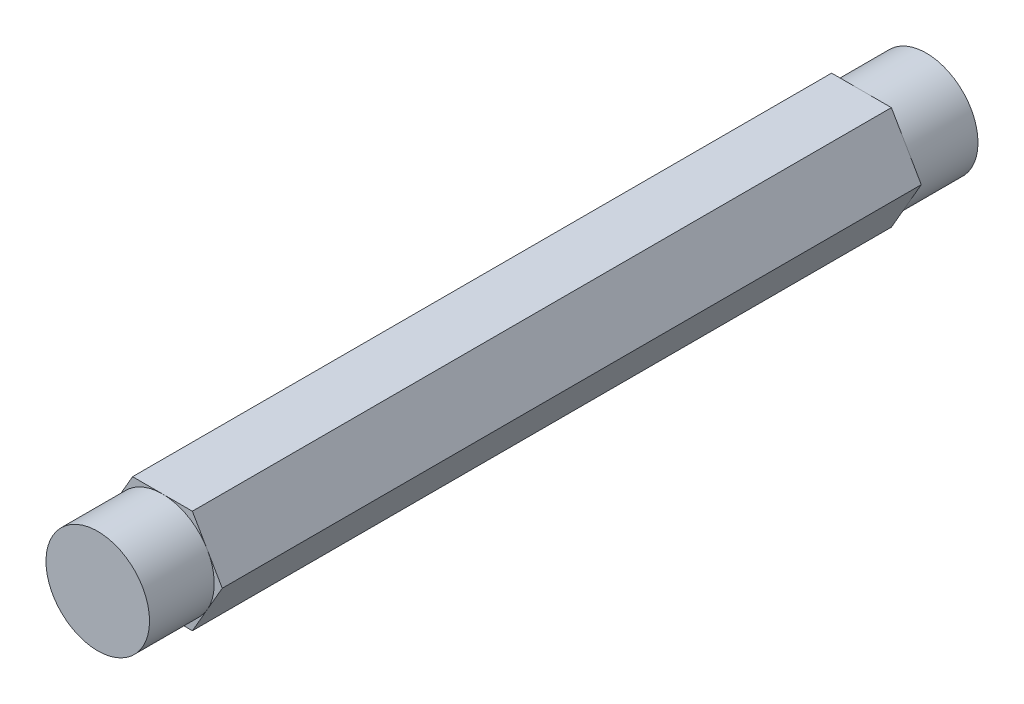
ISO-10303-21;
HEADER;
FILE_DESCRIPTION(('STEP AP214'),'2;1');
FILE_NAME('part.step','',(''),(''),'','','');
FILE_SCHEMA(('AUTOMOTIVE_DESIGN { 1 0 10303 214 1 1 1 1 }'));
ENDSEC;
DATA;
#1=APPLICATION_CONTEXT('core data for automotive mechanical design processes');
#2=APPLICATION_PROTOCOL_DEFINITION('international standard','automotive_design',2000,#1);
#3=PRODUCT_CONTEXT('',#1,'mechanical');
#4=PRODUCT('Part','Part','',(#3));
#5=PRODUCT_RELATED_PRODUCT_CATEGORY('part','',(#4));
#6=PRODUCT_DEFINITION_FORMATION('','',#4);
#7=PRODUCT_DEFINITION_CONTEXT('part definition',#1,'design');
#8=PRODUCT_DEFINITION('design','',#6,#7);
#9=PRODUCT_DEFINITION_SHAPE('','',#8);
#10=(LENGTH_UNIT() NAMED_UNIT(*) SI_UNIT(.MILLI.,.METRE.));
#11=(NAMED_UNIT(*) PLANE_ANGLE_UNIT() SI_UNIT($,.RADIAN.));
#12=(NAMED_UNIT(*) SI_UNIT($,.STERADIAN.) SOLID_ANGLE_UNIT());
#13=UNCERTAINTY_MEASURE_WITH_UNIT(LENGTH_MEASURE(1.E-05),#10,'distance_accuracy_value','');
#14=(GEOMETRIC_REPRESENTATION_CONTEXT(3) GLOBAL_UNCERTAINTY_ASSIGNED_CONTEXT((#13)) GLOBAL_UNIT_ASSIGNED_CONTEXT((#10,
#11,#12)) REPRESENTATION_CONTEXT('',''));
#15=CARTESIAN_POINT('',(0.,0.,0.));
#16=DIRECTION('',(0.,0.,1.));
#17=DIRECTION('',(1.,0.,0.));
#18=AXIS2_PLACEMENT_3D('',#15,#16,#17);
#19=CARTESIAN_POINT('',(0.,0.,-50.8));
#20=DIRECTION('',(0.,0.,1.));
#21=DIRECTION('',(1.,0.,0.));
#22=AXIS2_PLACEMENT_3D('',#19,#20,#21);
#23=PLANE('',#22);
#24=CARTESIAN_POINT('',(0.,0.,-50.8));
#25=DIRECTION('',(0.,0.,1.));
#26=DIRECTION('',(1.,0.,0.));
#27=AXIS2_PLACEMENT_3D('',#24,#25,#26);
#28=CIRCLE('',#27,6.35);
#29=CARTESIAN_POINT('',(6.35,0.,-50.8));
#30=VERTEX_POINT('',#29);
#31=EDGE_CURVE('E177',#30,#30,#28,.F.);
#32=ORIENTED_EDGE('',*,*,#31,.T.);
#33=EDGE_LOOP('',(#32));
#34=FACE_BOUND('',#33,.T.);
#35=ADVANCED_FACE('F49',(#34),#23,.F.);
#36=CARTESIAN_POINT('',(5.49926131403116,3.17499999999999,50.8));
#37=DIRECTION('',(-0.866025403784438,-0.500000000000001,0.));
#38=DIRECTION('',(0.500000000000001,-0.866025403784438,0.));
#39=AXIS2_PLACEMENT_3D('',#36,#37,#38);
#40=PLANE('',#39);
#41=DIRECTION('',(0.500000000000001,-0.866025403784438,0.));
#42=VECTOR('',#41,1.);
#43=CARTESIAN_POINT('',(5.49926131403116,3.17499999999999,-42.8625));
#44=LINE('',#43,#42);
#45=CARTESIAN_POINT('',(5.49926131403117,3.175,-42.8625));
#46=VERTEX_POINT('',#45);
#47=CARTESIAN_POINT('',(7.33234841870822,0.,-42.8625));
#48=VERTEX_POINT('',#47);
#49=EDGE_CURVE('E197',#46,#48,#44,.T.);
#50=ORIENTED_EDGE('',*,*,#49,.F.);
#51=DIRECTION('',(0.500000000000001,-0.866025403784438,0.));
#52=VECTOR('',#51,1.);
#53=CARTESIAN_POINT('',(5.49926131403116,3.17499999999999,-42.8625));
#54=LINE('',#53,#52);
#55=CARTESIAN_POINT('',(3.6661742093541,6.34999999999998,-42.8625));
#56=VERTEX_POINT('',#55);
#57=EDGE_CURVE('E488',#56,#46,#54,.T.);
#58=ORIENTED_EDGE('',*,*,#57,.F.);
#59=DIRECTION('',(0.,0.,-1.));
#60=VECTOR('',#59,1.);
#61=CARTESIAN_POINT('',(3.6661742093541,6.34999999999998,50.8));
#62=LINE('',#61,#60);
#63=CARTESIAN_POINT('',(3.6661742093541,6.34999999999998,42.8625));
#64=VERTEX_POINT('',#63);
#65=EDGE_CURVE('E254',#64,#56,#62,.T.);
#66=ORIENTED_EDGE('',*,*,#65,.F.);
#67=DIRECTION('',(0.500000000000001,-0.866025403784438,0.));
#68=VECTOR('',#67,1.);
#69=CARTESIAN_POINT('',(5.49926131403116,3.17499999999999,42.8625));
#70=LINE('',#69,#68);
#71=CARTESIAN_POINT('',(5.49926131403117,3.175,42.8625));
#72=VERTEX_POINT('',#71);
#73=EDGE_CURVE('E206',#64,#72,#70,.T.);
#74=ORIENTED_EDGE('',*,*,#73,.T.);
#75=DIRECTION('',(0.500000000000001,-0.866025403784438,0.));
#76=VECTOR('',#75,1.);
#77=CARTESIAN_POINT('',(5.49926131403116,3.17499999999999,42.8625));
#78=LINE('',#77,#76);
#79=CARTESIAN_POINT('',(7.33234841870822,0.,42.8625));
#80=VERTEX_POINT('',#79);
#81=EDGE_CURVE('E243',#72,#80,#78,.T.);
#82=ORIENTED_EDGE('',*,*,#81,.T.);
#83=DIRECTION('',(0.,0.,-1.));
#84=VECTOR('',#83,1.);
#85=CARTESIAN_POINT('',(7.33234841870822,0.,50.8));
#86=LINE('',#85,#84);
#87=EDGE_CURVE('E58',#80,#48,#86,.T.);
#88=ORIENTED_EDGE('',*,*,#87,.T.);
#89=EDGE_LOOP('',(#50,#58,#66,#74,#82,#88));
#90=FACE_BOUND('',#89,.T.);
#91=ADVANCED_FACE('F260',(#90),#40,.F.);
#92=CARTESIAN_POINT('',(0.,-6.34999999999997,50.8));
#93=DIRECTION('',(0.,1.,0.));
#94=DIRECTION('',(-1.,0.,0.));
#95=AXIS2_PLACEMENT_3D('',#92,#93,#94);
#96=PLANE('',#95);
#97=DIRECTION('',(-1.,0.,0.));
#98=VECTOR('',#97,1.);
#99=CARTESIAN_POINT('',(0.,-6.34999999999997,-42.8625));
#100=LINE('',#99,#98);
#101=CARTESIAN_POINT('',(0.,-6.34999999999999,-42.8625));
#102=VERTEX_POINT('',#101);
#103=CARTESIAN_POINT('',(-3.66617420935405,-6.35000000000001,-42.8625));
#104=VERTEX_POINT('',#103);
#105=EDGE_CURVE('E174',#102,#104,#100,.T.);
#106=ORIENTED_EDGE('',*,*,#105,.F.);
#107=DIRECTION('',(-1.,0.,0.));
#108=VECTOR('',#107,1.);
#109=CARTESIAN_POINT('',(0.,-6.34999999999997,-42.8625));
#110=LINE('',#109,#108);
#111=CARTESIAN_POINT('',(3.66617420935418,-6.34999999999993,-42.8625));
#112=VERTEX_POINT('',#111);
#113=EDGE_CURVE('E150',#112,#102,#110,.T.);
#114=ORIENTED_EDGE('',*,*,#113,.F.);
#115=DIRECTION('',(0.,0.,-1.));
#116=VECTOR('',#115,1.);
#117=CARTESIAN_POINT('',(3.66617420935418,-6.34999999999993,50.8));
#118=LINE('',#117,#116);
#119=CARTESIAN_POINT('',(3.66617420935418,-6.34999999999993,42.8625));
#120=VERTEX_POINT('',#119);
#121=EDGE_CURVE('E12',#120,#112,#118,.T.);
#122=ORIENTED_EDGE('',*,*,#121,.F.);
#123=DIRECTION('',(-1.,0.,0.));
#124=VECTOR('',#123,1.);
#125=CARTESIAN_POINT('',(0.,-6.34999999999997,42.8625));
#126=LINE('',#125,#124);
#127=CARTESIAN_POINT('',(0.,-6.34999999999999,42.8625));
#128=VERTEX_POINT('',#127);
#129=EDGE_CURVE('E214',#120,#128,#126,.T.);
#130=ORIENTED_EDGE('',*,*,#129,.T.);
#131=DIRECTION('',(-1.,0.,0.));
#132=VECTOR('',#131,1.);
#133=CARTESIAN_POINT('',(0.,-6.34999999999997,42.8625));
#134=LINE('',#133,#132);
#135=CARTESIAN_POINT('',(-3.66617420935405,-6.35000000000001,42.8625));
#136=VERTEX_POINT('',#135);
#137=EDGE_CURVE('E237',#128,#136,#134,.T.);
#138=ORIENTED_EDGE('',*,*,#137,.T.);
#139=DIRECTION('',(0.,0.,-1.));
#140=VECTOR('',#139,1.);
#141=CARTESIAN_POINT('',(-3.66617420935405,-6.35000000000001,50.8));
#142=LINE('',#141,#140);
#143=EDGE_CURVE('E181',#136,#104,#142,.T.);
#144=ORIENTED_EDGE('',*,*,#143,.T.);
#145=EDGE_LOOP('',(#106,#114,#122,#130,#138,#144));
#146=FACE_BOUND('',#145,.T.);
#147=ADVANCED_FACE('F51',(#146),#96,.F.);
#148=CARTESIAN_POINT('',(-5.49926131403118,3.17499999999995,50.8));
#149=DIRECTION('',(0.866025403784442,-0.499999999999995,0.));
#150=DIRECTION('',(0.499999999999995,0.866025403784442,0.));
#151=AXIS2_PLACEMENT_3D('',#148,#149,#150);
#152=PLANE('',#151);
#153=DIRECTION('',(0.499999999999995,0.866025403784442,0.));
#154=VECTOR('',#153,1.);
#155=CARTESIAN_POINT('',(-5.49926131403118,3.17499999999995,-42.8625));
#156=LINE('',#155,#154);
#157=CARTESIAN_POINT('',(-5.49926131403119,3.17499999999996,-42.8625));
#158=VERTEX_POINT('',#157);
#159=CARTESIAN_POINT('',(-3.66617420935414,6.34999999999996,-42.8625));
#160=VERTEX_POINT('',#159);
#161=EDGE_CURVE('E190',#158,#160,#156,.T.);
#162=ORIENTED_EDGE('',*,*,#161,.F.);
#163=DIRECTION('',(0.499999999999995,0.866025403784442,0.));
#164=VECTOR('',#163,1.);
#165=CARTESIAN_POINT('',(-5.49926131403118,3.17499999999995,-42.8625));
#166=LINE('',#165,#164);
#167=CARTESIAN_POINT('',(-7.33234841870822,0.,-42.8625));
#168=VERTEX_POINT('',#167);
#169=EDGE_CURVE('E203',#168,#158,#166,.T.);
#170=ORIENTED_EDGE('',*,*,#169,.F.);
#171=DIRECTION('',(0.,0.,-1.));
#172=VECTOR('',#171,1.);
#173=CARTESIAN_POINT('',(-7.33234841870822,0.,50.8));
#174=LINE('',#173,#172);
#175=CARTESIAN_POINT('',(-7.33234841870822,0.,42.8625));
#176=VERTEX_POINT('',#175);
#177=EDGE_CURVE('E248',#176,#168,#174,.T.);
#178=ORIENTED_EDGE('',*,*,#177,.F.);
#179=DIRECTION('',(0.499999999999995,0.866025403784442,0.));
#180=VECTOR('',#179,1.);
#181=CARTESIAN_POINT('',(-5.49926131403118,3.17499999999995,42.8625));
#182=LINE('',#181,#180);
#183=CARTESIAN_POINT('',(-5.49926131403119,3.17499999999996,42.8625));
#184=VERTEX_POINT('',#183);
#185=EDGE_CURVE('E222',#176,#184,#182,.T.);
#186=ORIENTED_EDGE('',*,*,#185,.T.);
#187=DIRECTION('',(0.499999999999995,0.866025403784442,0.));
#188=VECTOR('',#187,1.);
#189=CARTESIAN_POINT('',(-5.49926131403118,3.17499999999995,42.8625));
#190=LINE('',#189,#188);
#191=CARTESIAN_POINT('',(-3.66617420935414,6.34999999999996,42.8625));
#192=VERTEX_POINT('',#191);
#193=EDGE_CURVE('E226',#184,#192,#190,.T.);
#194=ORIENTED_EDGE('',*,*,#193,.T.);
#195=DIRECTION('',(0.,0.,-1.));
#196=VECTOR('',#195,1.);
#197=CARTESIAN_POINT('',(-3.66617420935414,6.34999999999996,50.8));
#198=LINE('',#197,#196);
#199=EDGE_CURVE('E251',#192,#160,#198,.T.);
#200=ORIENTED_EDGE('',*,*,#199,.T.);
#201=EDGE_LOOP('',(#162,#170,#178,#186,#194,#200));
#202=FACE_BOUND('',#201,.T.);
#203=ADVANCED_FACE('F295',(#202),#152,.F.);
#204=CARTESIAN_POINT('',(0.,6.34999999999997,50.8));
#205=DIRECTION('',(0.,-1.,0.));
#206=DIRECTION('',(1.,0.,0.));
#207=AXIS2_PLACEMENT_3D('',#204,#205,#206);
#208=PLANE('',#207);
#209=ORIENTED_EDGE('',*,*,#65,.T.);
#210=DIRECTION('',(1.,0.,0.));
#211=VECTOR('',#210,1.);
#212=CARTESIAN_POINT('',(0.,6.34999999999997,-42.8625));
#213=LINE('',#212,#211);
#214=CARTESIAN_POINT('',(0.,6.34999999999999,-42.8625));
#215=VERTEX_POINT('',#214);
#216=EDGE_CURVE('E487',#215,#56,#213,.T.);
#217=ORIENTED_EDGE('',*,*,#216,.F.);
#218=DIRECTION('',(1.,0.,0.));
#219=VECTOR('',#218,1.);
#220=CARTESIAN_POINT('',(0.,6.34999999999997,-42.8625));
#221=LINE('',#220,#219);
#222=EDGE_CURVE('E183',#160,#215,#221,.T.);
#223=ORIENTED_EDGE('',*,*,#222,.F.);
#224=ORIENTED_EDGE('',*,*,#199,.F.);
#225=DIRECTION('',(1.,0.,0.));
#226=VECTOR('',#225,1.);
#227=CARTESIAN_POINT('',(0.,6.34999999999997,42.8625));
#228=LINE('',#227,#226);
#229=CARTESIAN_POINT('',(0.,6.34999999999999,42.8625));
#230=VERTEX_POINT('',#229);
#231=EDGE_CURVE('E229',#192,#230,#228,.T.);
#232=ORIENTED_EDGE('',*,*,#231,.T.);
#233=DIRECTION('',(1.,0.,0.));
#234=VECTOR('',#233,1.);
#235=CARTESIAN_POINT('',(0.,6.34999999999997,42.8625));
#236=LINE('',#235,#234);
#237=EDGE_CURVE('E189',#230,#64,#236,.T.);
#238=ORIENTED_EDGE('',*,*,#237,.T.);
#239=EDGE_LOOP('',(#209,#217,#223,#224,#232,#238));
#240=FACE_BOUND('',#239,.T.);
#241=ADVANCED_FACE('F298',(#240),#208,.F.);
#242=CARTESIAN_POINT('',(5.4992613140312,-3.17499999999997,50.8));
#243=DIRECTION('',(-0.866025403784441,0.499999999999995,0.));
#244=DIRECTION('',(-0.499999999999995,-0.866025403784442,0.));
#245=AXIS2_PLACEMENT_3D('',#242,#243,#244);
#246=PLANE('',#245);
#247=ORIENTED_EDGE('',*,*,#121,.T.);
#248=DIRECTION('',(-0.499999999999995,-0.866025403784442,0.));
#249=VECTOR('',#248,1.);
#250=CARTESIAN_POINT('',(5.4992613140312,-3.17499999999997,-42.8625));
#251=LINE('',#250,#249);
#252=CARTESIAN_POINT('',(5.4992613140312,-3.17499999999997,-42.8625));
#253=VERTEX_POINT('',#252);
#254=EDGE_CURVE('E155',#253,#112,#251,.T.);
#255=ORIENTED_EDGE('',*,*,#254,.F.);
#256=DIRECTION('',(-0.499999999999995,-0.866025403784442,0.));
#257=VECTOR('',#256,1.);
#258=CARTESIAN_POINT('',(5.4992613140312,-3.17499999999997,-42.8625));
#259=LINE('',#258,#257);
#260=EDGE_CURVE('E199',#48,#253,#259,.T.);
#261=ORIENTED_EDGE('',*,*,#260,.F.);
#262=ORIENTED_EDGE('',*,*,#87,.F.);
#263=DIRECTION('',(-0.499999999999995,-0.866025403784442,0.));
#264=VECTOR('',#263,1.);
#265=CARTESIAN_POINT('',(5.4992613140312,-3.17499999999997,42.8625));
#266=LINE('',#265,#264);
#267=CARTESIAN_POINT('',(5.4992613140312,-3.17499999999997,42.8625));
#268=VERTEX_POINT('',#267);
#269=EDGE_CURVE('E85',#80,#268,#266,.T.);
#270=ORIENTED_EDGE('',*,*,#269,.T.);
#271=DIRECTION('',(-0.499999999999995,-0.866025403784442,0.));
#272=VECTOR('',#271,1.);
#273=CARTESIAN_POINT('',(5.4992613140312,-3.17499999999997,42.8625));
#274=LINE('',#273,#272);
#275=EDGE_CURVE('E211',#268,#120,#274,.T.);
#276=ORIENTED_EDGE('',*,*,#275,.T.);
#277=EDGE_LOOP('',(#247,#255,#261,#262,#270,#276));
#278=FACE_BOUND('',#277,.T.);
#279=ADVANCED_FACE('F264',(#278),#246,.F.);
#280=CARTESIAN_POINT('',(-5.49926131403114,-3.17500000000003,50.8));
#281=DIRECTION('',(0.866025403784435,0.500000000000007,0.));
#282=DIRECTION('',(-0.500000000000007,0.866025403784435,0.));
#283=AXIS2_PLACEMENT_3D('',#280,#281,#282);
#284=PLANE('',#283);
#285=ORIENTED_EDGE('',*,*,#177,.T.);
#286=DIRECTION('',(-0.500000000000007,0.866025403784435,0.));
#287=VECTOR('',#286,1.);
#288=CARTESIAN_POINT('',(-5.49926131403114,-3.17500000000003,-42.8625));
#289=LINE('',#288,#287);
#290=CARTESIAN_POINT('',(-5.49926131403115,-3.17500000000004,-42.8625));
#291=VERTEX_POINT('',#290);
#292=EDGE_CURVE('E501',#291,#168,#289,.T.);
#293=ORIENTED_EDGE('',*,*,#292,.F.);
#294=DIRECTION('',(-0.500000000000007,0.866025403784435,0.));
#295=VECTOR('',#294,1.);
#296=CARTESIAN_POINT('',(-5.49926131403114,-3.17500000000003,-42.8625));
#297=LINE('',#296,#295);
#298=EDGE_CURVE('E176',#104,#291,#297,.T.);
#299=ORIENTED_EDGE('',*,*,#298,.F.);
#300=ORIENTED_EDGE('',*,*,#143,.F.);
#301=DIRECTION('',(-0.500000000000007,0.866025403784435,0.));
#302=VECTOR('',#301,1.);
#303=CARTESIAN_POINT('',(-5.49926131403114,-3.17500000000003,42.8625));
#304=LINE('',#303,#302);
#305=CARTESIAN_POINT('',(-5.49926131403115,-3.17500000000004,42.8625));
#306=VERTEX_POINT('',#305);
#307=EDGE_CURVE('E77',#136,#306,#304,.T.);
#308=ORIENTED_EDGE('',*,*,#307,.T.);
#309=DIRECTION('',(-0.500000000000007,0.866025403784435,0.));
#310=VECTOR('',#309,1.);
#311=CARTESIAN_POINT('',(-5.49926131403114,-3.17500000000003,42.8625));
#312=LINE('',#311,#310);
#313=EDGE_CURVE('E217',#306,#176,#312,.T.);
#314=ORIENTED_EDGE('',*,*,#313,.T.);
#315=EDGE_LOOP('',(#285,#293,#299,#300,#308,#314));
#316=FACE_BOUND('',#315,.T.);
#317=ADVANCED_FACE('F291',(#316),#284,.F.);
#318=CARTESIAN_POINT('',(0.,0.,50.8));
#319=DIRECTION('',(0.,0.,1.));
#320=DIRECTION('',(1.,0.,0.));
#321=AXIS2_PLACEMENT_3D('',#318,#319,#320);
#322=PLANE('',#321);
#323=CARTESIAN_POINT('',(0.,0.,50.8));
#324=DIRECTION('',(0.,0.,1.));
#325=DIRECTION('',(1.,0.,0.));
#326=AXIS2_PLACEMENT_3D('',#323,#324,#325);
#327=CIRCLE('',#326,6.35);
#328=CARTESIAN_POINT('',(6.35,0.,50.8));
#329=VERTEX_POINT('',#328);
#330=EDGE_CURVE('E234',#329,#329,#327,.T.);
#331=ORIENTED_EDGE('',*,*,#330,.T.);
#332=EDGE_LOOP('',(#331));
#333=FACE_BOUND('',#332,.T.);
#334=ADVANCED_FACE('F289',(#333),#322,.T.);
#335=CARTESIAN_POINT('',(0.,0.,42.8625));
#336=DIRECTION('',(0.,0.,1.));
#337=DIRECTION('',(1.,0.,0.));
#338=AXIS2_PLACEMENT_3D('',#335,#336,#337);
#339=PLANE('',#338);
#340=CARTESIAN_POINT('',(0.,0.,42.8625));
#341=DIRECTION('',(0.,0.,1.));
#342=DIRECTION('',(1.,0.,0.));
#343=AXIS2_PLACEMENT_3D('',#340,#341,#342);
#344=CIRCLE('',#343,6.35);
#345=EDGE_CURVE('E225',#268,#72,#344,.T.);
#346=ORIENTED_EDGE('',*,*,#345,.F.);
#347=ORIENTED_EDGE('',*,*,#269,.F.);
#348=ORIENTED_EDGE('',*,*,#81,.F.);
#349=EDGE_LOOP('',(#346,#347,#348));
#350=FACE_BOUND('',#349,.T.);
#351=ADVANCED_FACE('F317',(#350),#339,.T.);
#352=CARTESIAN_POINT('',(0.,0.,42.8625));
#353=DIRECTION('',(0.,0.,1.));
#354=DIRECTION('',(1.,0.,0.));
#355=AXIS2_PLACEMENT_3D('',#352,#353,#354);
#356=PLANE('',#355);
#357=CARTESIAN_POINT('',(0.,0.,42.8625));
#358=DIRECTION('',(0.,0.,1.));
#359=DIRECTION('',(1.,0.,0.));
#360=AXIS2_PLACEMENT_3D('',#357,#358,#359);
#361=CIRCLE('',#360,6.35);
#362=EDGE_CURVE('E239',#306,#128,#361,.T.);
#363=ORIENTED_EDGE('',*,*,#362,.F.);
#364=ORIENTED_EDGE('',*,*,#307,.F.);
#365=ORIENTED_EDGE('',*,*,#137,.F.);
#366=EDGE_LOOP('',(#363,#364,#365));
#367=FACE_BOUND('',#366,.T.);
#368=ADVANCED_FACE('F324',(#367),#356,.T.);
#369=CARTESIAN_POINT('',(0.,0.,50.801));
#370=DIRECTION('',(0.,0.,-1.));
#371=DIRECTION('',(-1.,0.,0.));
#372=AXIS2_PLACEMENT_3D('',#369,#370,#371);
#373=CYLINDRICAL_SURFACE('',#372,6.35);
#374=ORIENTED_EDGE('',*,*,#345,.T.);
#375=CARTESIAN_POINT('',(0.,0.,42.8625));
#376=DIRECTION('',(0.,0.,1.));
#377=DIRECTION('',(1.,0.,0.));
#378=AXIS2_PLACEMENT_3D('',#375,#376,#377);
#379=CIRCLE('',#378,6.35);
#380=EDGE_CURVE('E66',#72,#230,#379,.T.);
#381=ORIENTED_EDGE('',*,*,#380,.T.);
#382=CARTESIAN_POINT('',(0.,0.,42.8625));
#383=DIRECTION('',(0.,0.,1.));
#384=DIRECTION('',(1.,0.,0.));
#385=AXIS2_PLACEMENT_3D('',#382,#383,#384);
#386=CIRCLE('',#385,6.35);
#387=EDGE_CURVE('E232',#230,#184,#386,.T.);
#388=ORIENTED_EDGE('',*,*,#387,.T.);
#389=CARTESIAN_POINT('',(0.,0.,42.8625));
#390=DIRECTION('',(0.,0.,1.));
#391=DIRECTION('',(1.,0.,0.));
#392=AXIS2_PLACEMENT_3D('',#389,#390,#391);
#393=CIRCLE('',#392,6.35);
#394=EDGE_CURVE('E94',#184,#306,#393,.T.);
#395=ORIENTED_EDGE('',*,*,#394,.T.);
#396=ORIENTED_EDGE('',*,*,#362,.T.);
#397=CARTESIAN_POINT('',(0.,0.,42.8625));
#398=DIRECTION('',(0.,0.,1.));
#399=DIRECTION('',(1.,0.,0.));
#400=AXIS2_PLACEMENT_3D('',#397,#398,#399);
#401=CIRCLE('',#400,6.35);
#402=EDGE_CURVE('E210',#128,#268,#401,.T.);
#403=ORIENTED_EDGE('',*,*,#402,.T.);
#404=EDGE_LOOP('',(#374,#381,#388,#395,#396,#403));
#405=FACE_BOUND('',#404,.T.);
#406=ORIENTED_EDGE('',*,*,#330,.F.);
#407=EDGE_LOOP('',(#406));
#408=FACE_BOUND('',#407,.T.);
#409=ADVANCED_FACE('F330',(#405,#408),#373,.T.);
#410=CARTESIAN_POINT('',(0.,0.,42.8625));
#411=DIRECTION('',(0.,0.,1.));
#412=DIRECTION('',(1.,0.,0.));
#413=AXIS2_PLACEMENT_3D('',#410,#411,#412);
#414=PLANE('',#413);
#415=ORIENTED_EDGE('',*,*,#193,.F.);
#416=ORIENTED_EDGE('',*,*,#387,.F.);
#417=ORIENTED_EDGE('',*,*,#231,.F.);
#418=EDGE_LOOP('',(#415,#416,#417));
#419=FACE_BOUND('',#418,.T.);
#420=ADVANCED_FACE('F337',(#419),#414,.T.);
#421=CARTESIAN_POINT('',(0.,0.,42.8625));
#422=DIRECTION('',(0.,0.,1.));
#423=DIRECTION('',(1.,0.,0.));
#424=AXIS2_PLACEMENT_3D('',#421,#422,#423);
#425=PLANE('',#424);
#426=ORIENTED_EDGE('',*,*,#313,.F.);
#427=ORIENTED_EDGE('',*,*,#394,.F.);
#428=ORIENTED_EDGE('',*,*,#185,.F.);
#429=EDGE_LOOP('',(#426,#427,#428));
#430=FACE_BOUND('',#429,.T.);
#431=ADVANCED_FACE('F344',(#430),#425,.T.);
#432=CARTESIAN_POINT('',(0.,0.,42.8625));
#433=DIRECTION('',(0.,0.,1.));
#434=DIRECTION('',(1.,0.,0.));
#435=AXIS2_PLACEMENT_3D('',#432,#433,#434);
#436=PLANE('',#435);
#437=ORIENTED_EDGE('',*,*,#402,.F.);
#438=ORIENTED_EDGE('',*,*,#129,.F.);
#439=ORIENTED_EDGE('',*,*,#275,.F.);
#440=EDGE_LOOP('',(#437,#438,#439));
#441=FACE_BOUND('',#440,.T.);
#442=ADVANCED_FACE('F277',(#441),#436,.T.);
#443=CARTESIAN_POINT('',(0.,0.,42.8625));
#444=DIRECTION('',(0.,0.,1.));
#445=DIRECTION('',(1.,0.,0.));
#446=AXIS2_PLACEMENT_3D('',#443,#444,#445);
#447=PLANE('',#446);
#448=ORIENTED_EDGE('',*,*,#237,.F.);
#449=ORIENTED_EDGE('',*,*,#380,.F.);
#450=ORIENTED_EDGE('',*,*,#73,.F.);
#451=EDGE_LOOP('',(#448,#449,#450));
#452=FACE_BOUND('',#451,.T.);
#453=ADVANCED_FACE('F269',(#452),#447,.T.);
#454=CARTESIAN_POINT('',(0.,0.,-42.8625));
#455=DIRECTION('',(0.,0.,1.));
#456=DIRECTION('',(1.,0.,0.));
#457=AXIS2_PLACEMENT_3D('',#454,#455,#456);
#458=PLANE('',#457);
#459=ORIENTED_EDGE('',*,*,#49,.T.);
#460=ORIENTED_EDGE('',*,*,#260,.T.);
#461=CARTESIAN_POINT('',(0.,0.,-42.8625));
#462=DIRECTION('',(0.,0.,1.));
#463=DIRECTION('',(1.,0.,0.));
#464=AXIS2_PLACEMENT_3D('',#461,#462,#463);
#465=CIRCLE('',#464,6.35);
#466=EDGE_CURVE('E169',#253,#46,#465,.T.);
#467=ORIENTED_EDGE('',*,*,#466,.T.);
#468=EDGE_LOOP('',(#459,#460,#467));
#469=FACE_BOUND('',#468,.T.);
#470=ADVANCED_FACE('F266',(#469),#458,.F.);
#471=CARTESIAN_POINT('',(0.,0.,-42.8625));
#472=DIRECTION('',(0.,0.,1.));
#473=DIRECTION('',(1.,0.,0.));
#474=AXIS2_PLACEMENT_3D('',#471,#472,#473);
#475=PLANE('',#474);
#476=ORIENTED_EDGE('',*,*,#222,.T.);
#477=CARTESIAN_POINT('',(0.,0.,-42.8625));
#478=DIRECTION('',(0.,0.,1.));
#479=DIRECTION('',(1.,0.,0.));
#480=AXIS2_PLACEMENT_3D('',#477,#478,#479);
#481=CIRCLE('',#480,6.35);
#482=EDGE_CURVE('E192',#215,#158,#481,.T.);
#483=ORIENTED_EDGE('',*,*,#482,.T.);
#484=ORIENTED_EDGE('',*,*,#161,.T.);
#485=EDGE_LOOP('',(#476,#483,#484));
#486=FACE_BOUND('',#485,.T.);
#487=ADVANCED_FACE('F268',(#486),#475,.F.);
#488=CARTESIAN_POINT('',(0.,0.,-50.801));
#489=DIRECTION('',(0.,0.,1.));
#490=DIRECTION('',(1.,0.,0.));
#491=AXIS2_PLACEMENT_3D('',#488,#489,#490);
#492=CYLINDRICAL_SURFACE('',#491,6.35);
#493=ORIENTED_EDGE('',*,*,#31,.F.);
#494=EDGE_LOOP('',(#493));
#495=FACE_BOUND('',#494,.T.);
#496=CARTESIAN_POINT('',(0.,0.,-42.8625));
#497=DIRECTION('',(0.,0.,1.));
#498=DIRECTION('',(1.,0.,0.));
#499=AXIS2_PLACEMENT_3D('',#496,#497,#498);
#500=CIRCLE('',#499,6.35);
#501=EDGE_CURVE('E166',#291,#102,#500,.T.);
#502=ORIENTED_EDGE('',*,*,#501,.F.);
#503=CARTESIAN_POINT('',(0.,0.,-42.8625));
#504=DIRECTION('',(0.,0.,1.));
#505=DIRECTION('',(1.,0.,0.));
#506=AXIS2_PLACEMENT_3D('',#503,#504,#505);
#507=CIRCLE('',#506,6.35);
#508=EDGE_CURVE('E493',#158,#291,#507,.T.);
#509=ORIENTED_EDGE('',*,*,#508,.F.);
#510=ORIENTED_EDGE('',*,*,#482,.F.);
#511=CARTESIAN_POINT('',(0.,0.,-42.8625));
#512=DIRECTION('',(0.,0.,1.));
#513=DIRECTION('',(1.,0.,0.));
#514=AXIS2_PLACEMENT_3D('',#511,#512,#513);
#515=CIRCLE('',#514,6.35);
#516=EDGE_CURVE('E489',#46,#215,#515,.T.);
#517=ORIENTED_EDGE('',*,*,#516,.F.);
#518=ORIENTED_EDGE('',*,*,#466,.F.);
#519=CARTESIAN_POINT('',(0.,0.,-42.8625));
#520=DIRECTION('',(0.,0.,1.));
#521=DIRECTION('',(1.,0.,0.));
#522=AXIS2_PLACEMENT_3D('',#519,#520,#521);
#523=CIRCLE('',#522,6.35);
#524=EDGE_CURVE('E153',#102,#253,#523,.T.);
#525=ORIENTED_EDGE('',*,*,#524,.F.);
#526=EDGE_LOOP('',(#502,#509,#510,#517,#518,#525));
#527=FACE_BOUND('',#526,.T.);
#528=ADVANCED_FACE('F164',(#495,#527),#492,.T.);
#529=CARTESIAN_POINT('',(0.,0.,-42.8625));
#530=DIRECTION('',(0.,0.,1.));
#531=DIRECTION('',(1.,0.,0.));
#532=AXIS2_PLACEMENT_3D('',#529,#530,#531);
#533=PLANE('',#532);
#534=ORIENTED_EDGE('',*,*,#105,.T.);
#535=ORIENTED_EDGE('',*,*,#298,.T.);
#536=ORIENTED_EDGE('',*,*,#501,.T.);
#537=EDGE_LOOP('',(#534,#535,#536));
#538=FACE_BOUND('',#537,.T.);
#539=ADVANCED_FACE('F173',(#538),#533,.F.);
#540=CARTESIAN_POINT('',(0.,0.,-42.8625));
#541=DIRECTION('',(0.,0.,1.));
#542=DIRECTION('',(1.,0.,0.));
#543=AXIS2_PLACEMENT_3D('',#540,#541,#542);
#544=PLANE('',#543);
#545=ORIENTED_EDGE('',*,*,#169,.T.);
#546=ORIENTED_EDGE('',*,*,#508,.T.);
#547=ORIENTED_EDGE('',*,*,#292,.T.);
#548=EDGE_LOOP('',(#545,#546,#547));
#549=FACE_BOUND('',#548,.T.);
#550=ADVANCED_FACE('F454',(#549),#544,.F.);
#551=CARTESIAN_POINT('',(0.,0.,-42.8625));
#552=DIRECTION('',(0.,0.,1.));
#553=DIRECTION('',(1.,0.,0.));
#554=AXIS2_PLACEMENT_3D('',#551,#552,#553);
#555=PLANE('',#554);
#556=ORIENTED_EDGE('',*,*,#216,.T.);
#557=ORIENTED_EDGE('',*,*,#57,.T.);
#558=ORIENTED_EDGE('',*,*,#516,.T.);
#559=EDGE_LOOP('',(#556,#557,#558));
#560=FACE_BOUND('',#559,.T.);
#561=ADVANCED_FACE('F462',(#560),#555,.F.);
#562=CARTESIAN_POINT('',(0.,0.,-42.8625));
#563=DIRECTION('',(0.,0.,1.));
#564=DIRECTION('',(1.,0.,0.));
#565=AXIS2_PLACEMENT_3D('',#562,#563,#564);
#566=PLANE('',#565);
#567=ORIENTED_EDGE('',*,*,#254,.T.);
#568=ORIENTED_EDGE('',*,*,#113,.T.);
#569=ORIENTED_EDGE('',*,*,#524,.T.);
#570=EDGE_LOOP('',(#567,#568,#569));
#571=FACE_BOUND('',#570,.T.);
#572=ADVANCED_FACE('F152',(#571),#566,.F.);
#573=CLOSED_SHELL('',(#35,#91,#147,#203,#241,#279,#317,#334,#351,#368,#409,#420,#431,#442,#453,
#470,#487,#528,#539,#550,#561,#572));
#574=MANIFOLD_SOLID_BREP('B2',#573);
#575=ADVANCED_BREP_SHAPE_REPRESENTATION('',(#18,#574),#14);
#576=SHAPE_DEFINITION_REPRESENTATION(#9,#575);
ENDSEC;
END-ISO-10303-21;
